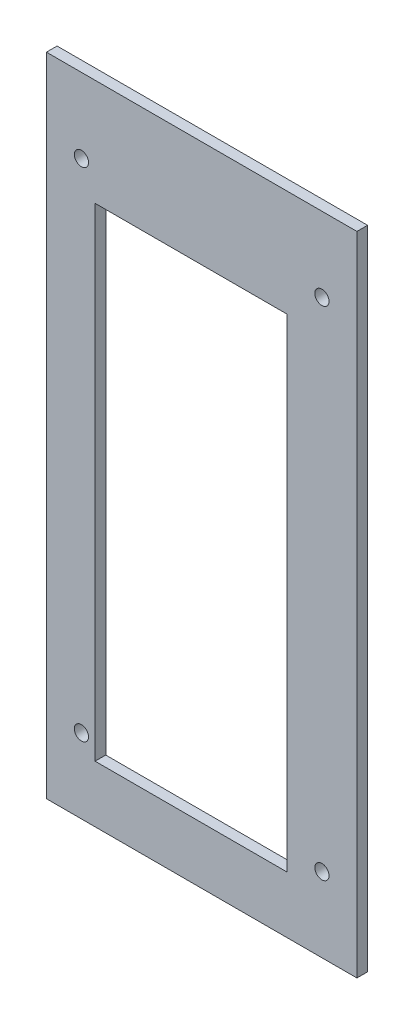
ISO-10303-21;
HEADER;
FILE_DESCRIPTION(('STEP AP214'),'2;1');
FILE_NAME('part.step','',(''),(''),'','','');
FILE_SCHEMA(('AUTOMOTIVE_DESIGN { 1 0 10303 214 1 1 1 1 }'));
ENDSEC;
DATA;
#1=APPLICATION_CONTEXT('core data for automotive mechanical design processes');
#2=APPLICATION_PROTOCOL_DEFINITION('international standard','automotive_design',2000,#1);
#3=PRODUCT_CONTEXT('',#1,'mechanical');
#4=PRODUCT('Part','Part','',(#3));
#5=PRODUCT_RELATED_PRODUCT_CATEGORY('part','',(#4));
#6=PRODUCT_DEFINITION_FORMATION('','',#4);
#7=PRODUCT_DEFINITION_CONTEXT('part definition',#1,'design');
#8=PRODUCT_DEFINITION('design','',#6,#7);
#9=PRODUCT_DEFINITION_SHAPE('','',#8);
#10=(LENGTH_UNIT() NAMED_UNIT(*) SI_UNIT(.MILLI.,.METRE.));
#11=(NAMED_UNIT(*) PLANE_ANGLE_UNIT() SI_UNIT($,.RADIAN.));
#12=(NAMED_UNIT(*) SI_UNIT($,.STERADIAN.) SOLID_ANGLE_UNIT());
#13=UNCERTAINTY_MEASURE_WITH_UNIT(LENGTH_MEASURE(1.E-05),#10,'distance_accuracy_value','');
#14=(GEOMETRIC_REPRESENTATION_CONTEXT(3) GLOBAL_UNCERTAINTY_ASSIGNED_CONTEXT((#13)) GLOBAL_UNIT_ASSIGNED_CONTEXT((#10,
#11,#12)) REPRESENTATION_CONTEXT('',''));
#15=CARTESIAN_POINT('',(0.,0.,0.));
#16=DIRECTION('',(0.,0.,1.));
#17=DIRECTION('',(1.,0.,0.));
#18=AXIS2_PLACEMENT_3D('',#15,#16,#17);
#19=CARTESIAN_POINT('',(0.,0.,1.5));
#20=DIRECTION('',(0.,0.,1.));
#21=DIRECTION('',(1.,0.,0.));
#22=AXIS2_PLACEMENT_3D('',#19,#20,#21);
#23=PLANE('',#22);
#24=CARTESIAN_POINT('',(-16.925,35.,1.5));
#25=DIRECTION('',(0.,0.,1.));
#26=DIRECTION('',(1.,0.,0.));
#27=AXIS2_PLACEMENT_3D('',#24,#25,#26);
#28=CIRCLE('',#27,1.00000000000001);
#29=CARTESIAN_POINT('',(-15.925,35.,1.5));
#30=VERTEX_POINT('',#29);
#31=EDGE_CURVE('E244',#30,#30,#28,.T.);
#32=ORIENTED_EDGE('',*,*,#31,.F.);
#33=EDGE_LOOP('',(#32));
#34=FACE_BOUND('',#33,.T.);
#35=CARTESIAN_POINT('',(16.925,35.,1.5));
#36=DIRECTION('',(0.,0.,1.));
#37=DIRECTION('',(1.,0.,0.));
#38=AXIS2_PLACEMENT_3D('',#35,#36,#37);
#39=CIRCLE('',#38,1.);
#40=CARTESIAN_POINT('',(17.925,35.,1.5));
#41=VERTEX_POINT('',#40);
#42=EDGE_CURVE('E126',#41,#41,#39,.T.);
#43=ORIENTED_EDGE('',*,*,#42,.F.);
#44=EDGE_LOOP('',(#43));
#45=FACE_BOUND('',#44,.T.);
#46=DIRECTION('',(0.,1.,0.));
#47=VECTOR('',#46,1.);
#48=CARTESIAN_POINT('',(21.85,45.5,1.5));
#49=LINE('',#48,#47);
#50=CARTESIAN_POINT('',(21.85,-45.5,1.5));
#51=VERTEX_POINT('',#50);
#52=CARTESIAN_POINT('',(21.85,45.5,1.5));
#53=VERTEX_POINT('',#52);
#54=EDGE_CURVE('E136',#51,#53,#49,.T.);
#55=ORIENTED_EDGE('',*,*,#54,.T.);
#56=DIRECTION('',(-1.,0.,0.));
#57=VECTOR('',#56,1.);
#58=CARTESIAN_POINT('',(-21.85,45.5,1.5));
#59=LINE('',#58,#57);
#60=CARTESIAN_POINT('',(-21.85,45.5,1.5));
#61=VERTEX_POINT('',#60);
#62=EDGE_CURVE('E139',#53,#61,#59,.T.);
#63=ORIENTED_EDGE('',*,*,#62,.T.);
#64=DIRECTION('',(0.,-1.,0.));
#65=VECTOR('',#64,1.);
#66=CARTESIAN_POINT('',(-21.85,45.5,1.5));
#67=LINE('',#66,#65);
#68=CARTESIAN_POINT('',(-21.85,-45.5,1.5));
#69=VERTEX_POINT('',#68);
#70=EDGE_CURVE('E142',#61,#69,#67,.T.);
#71=ORIENTED_EDGE('',*,*,#70,.T.);
#72=DIRECTION('',(1.,0.,0.));
#73=VECTOR('',#72,1.);
#74=CARTESIAN_POINT('',(-21.85,-45.5,1.5));
#75=LINE('',#74,#73);
#76=EDGE_CURVE('E144',#69,#51,#75,.T.);
#77=ORIENTED_EDGE('',*,*,#76,.T.);
#78=EDGE_LOOP('',(#55,#63,#71,#77));
#79=FACE_BOUND('',#78,.T.);
#80=DIRECTION('',(1.,0.,0.));
#81=VECTOR('',#80,1.);
#82=CARTESIAN_POINT('',(-15.,-37.5,1.5));
#83=LINE('',#82,#81);
#84=CARTESIAN_POINT('',(-15.,-37.5,1.5));
#85=VERTEX_POINT('',#84);
#86=CARTESIAN_POINT('',(12.,-37.5,1.5));
#87=VERTEX_POINT('',#86);
#88=EDGE_CURVE('E105',#85,#87,#83,.T.);
#89=ORIENTED_EDGE('',*,*,#88,.F.);
#90=DIRECTION('',(0.,-1.,0.));
#91=VECTOR('',#90,1.);
#92=CARTESIAN_POINT('',(-15.,30.5,1.5));
#93=LINE('',#92,#91);
#94=CARTESIAN_POINT('',(-15.,30.5,1.5));
#95=VERTEX_POINT('',#94);
#96=EDGE_CURVE('E97',#95,#85,#93,.T.);
#97=ORIENTED_EDGE('',*,*,#96,.F.);
#98=DIRECTION('',(-1.,0.,0.));
#99=VECTOR('',#98,1.);
#100=CARTESIAN_POINT('',(-15.,30.5,1.5));
#101=LINE('',#100,#99);
#102=CARTESIAN_POINT('',(12.,30.5,1.5));
#103=VERTEX_POINT('',#102);
#104=EDGE_CURVE('E120',#103,#95,#101,.T.);
#105=ORIENTED_EDGE('',*,*,#104,.F.);
#106=DIRECTION('',(0.,1.,0.));
#107=VECTOR('',#106,1.);
#108=CARTESIAN_POINT('',(12.,30.5,1.5));
#109=LINE('',#108,#107);
#110=EDGE_CURVE('E118',#87,#103,#109,.T.);
#111=ORIENTED_EDGE('',*,*,#110,.F.);
#112=EDGE_LOOP('',(#89,#97,#105,#111));
#113=FACE_BOUND('',#112,.T.);
#114=CARTESIAN_POINT('',(16.925,-35.,1.5));
#115=DIRECTION('',(0.,0.,1.));
#116=DIRECTION('',(1.,0.,0.));
#117=AXIS2_PLACEMENT_3D('',#114,#115,#116);
#118=CIRCLE('',#117,1.);
#119=CARTESIAN_POINT('',(17.925,-35.,1.5));
#120=VERTEX_POINT('',#119);
#121=EDGE_CURVE('E250',#120,#120,#118,.T.);
#122=ORIENTED_EDGE('',*,*,#121,.F.);
#123=EDGE_LOOP('',(#122));
#124=FACE_BOUND('',#123,.T.);
#125=CARTESIAN_POINT('',(-16.925,-35.,1.5));
#126=DIRECTION('',(0.,0.,1.));
#127=DIRECTION('',(1.,0.,0.));
#128=AXIS2_PLACEMENT_3D('',#125,#126,#127);
#129=CIRCLE('',#128,1.00000000000001);
#130=CARTESIAN_POINT('',(-15.925,-35.,1.5));
#131=VERTEX_POINT('',#130);
#132=EDGE_CURVE('E235',#131,#131,#129,.T.);
#133=ORIENTED_EDGE('',*,*,#132,.F.);
#134=EDGE_LOOP('',(#133));
#135=FACE_BOUND('',#134,.T.);
#136=ADVANCED_FACE('F32',(#34,#45,#79,#113,#124,#135),#23,.T.);
#137=CARTESIAN_POINT('',(0.,0.,0.));
#138=DIRECTION('',(0.,0.,1.));
#139=DIRECTION('',(1.,0.,0.));
#140=AXIS2_PLACEMENT_3D('',#137,#138,#139);
#141=PLANE('',#140);
#142=DIRECTION('',(0.,1.,0.));
#143=VECTOR('',#142,1.);
#144=CARTESIAN_POINT('',(21.85,45.5,0.));
#145=LINE('',#144,#143);
#146=CARTESIAN_POINT('',(21.85,-45.5,0.));
#147=VERTEX_POINT('',#146);
#148=CARTESIAN_POINT('',(21.85,45.5,0.));
#149=VERTEX_POINT('',#148);
#150=EDGE_CURVE('E113',#147,#149,#145,.T.);
#151=ORIENTED_EDGE('',*,*,#150,.F.);
#152=DIRECTION('',(1.,0.,0.));
#153=VECTOR('',#152,1.);
#154=CARTESIAN_POINT('',(-21.85,-45.5,0.));
#155=LINE('',#154,#153);
#156=CARTESIAN_POINT('',(-21.85,-45.5,0.));
#157=VERTEX_POINT('',#156);
#158=EDGE_CURVE('E140',#157,#147,#155,.T.);
#159=ORIENTED_EDGE('',*,*,#158,.F.);
#160=DIRECTION('',(0.,-1.,0.));
#161=VECTOR('',#160,1.);
#162=CARTESIAN_POINT('',(-21.85,45.5,0.));
#163=LINE('',#162,#161);
#164=CARTESIAN_POINT('',(-21.85,45.5,0.));
#165=VERTEX_POINT('',#164);
#166=EDGE_CURVE('E151',#165,#157,#163,.T.);
#167=ORIENTED_EDGE('',*,*,#166,.F.);
#168=DIRECTION('',(-1.,0.,0.));
#169=VECTOR('',#168,1.);
#170=CARTESIAN_POINT('',(-21.85,45.5,0.));
#171=LINE('',#170,#169);
#172=EDGE_CURVE('E149',#149,#165,#171,.T.);
#173=ORIENTED_EDGE('',*,*,#172,.F.);
#174=EDGE_LOOP('',(#151,#159,#167,#173));
#175=FACE_BOUND('',#174,.T.);
#176=DIRECTION('',(0.,-1.,0.));
#177=VECTOR('',#176,1.);
#178=CARTESIAN_POINT('',(-15.,30.5,0.));
#179=LINE('',#178,#177);
#180=CARTESIAN_POINT('',(-15.,30.5,0.));
#181=VERTEX_POINT('',#180);
#182=CARTESIAN_POINT('',(-15.,-37.5,0.));
#183=VERTEX_POINT('',#182);
#184=EDGE_CURVE('E55',#181,#183,#179,.T.);
#185=ORIENTED_EDGE('',*,*,#184,.T.);
#186=DIRECTION('',(1.,0.,0.));
#187=VECTOR('',#186,1.);
#188=CARTESIAN_POINT('',(-15.,-37.5,0.));
#189=LINE('',#188,#187);
#190=CARTESIAN_POINT('',(12.,-37.5,0.));
#191=VERTEX_POINT('',#190);
#192=EDGE_CURVE('E112',#183,#191,#189,.T.);
#193=ORIENTED_EDGE('',*,*,#192,.T.);
#194=DIRECTION('',(0.,1.,0.));
#195=VECTOR('',#194,1.);
#196=CARTESIAN_POINT('',(12.,30.5,0.));
#197=LINE('',#196,#195);
#198=CARTESIAN_POINT('',(12.,30.5,0.));
#199=VERTEX_POINT('',#198);
#200=EDGE_CURVE('E128',#191,#199,#197,.T.);
#201=ORIENTED_EDGE('',*,*,#200,.T.);
#202=DIRECTION('',(-1.,0.,0.));
#203=VECTOR('',#202,1.);
#204=CARTESIAN_POINT('',(-15.,30.5,0.));
#205=LINE('',#204,#203);
#206=EDGE_CURVE('E106',#199,#181,#205,.T.);
#207=ORIENTED_EDGE('',*,*,#206,.T.);
#208=EDGE_LOOP('',(#185,#193,#201,#207));
#209=FACE_BOUND('',#208,.T.);
#210=CARTESIAN_POINT('',(16.925,35.,0.));
#211=DIRECTION('',(0.,0.,1.));
#212=DIRECTION('',(1.,0.,0.));
#213=AXIS2_PLACEMENT_3D('',#210,#211,#212);
#214=CIRCLE('',#213,1.);
#215=CARTESIAN_POINT('',(17.925,35.,0.));
#216=VERTEX_POINT('',#215);
#217=EDGE_CURVE('E253',#216,#216,#214,.T.);
#218=ORIENTED_EDGE('',*,*,#217,.T.);
#219=EDGE_LOOP('',(#218));
#220=FACE_BOUND('',#219,.T.);
#221=CARTESIAN_POINT('',(16.925,-35.,0.));
#222=DIRECTION('',(0.,0.,1.));
#223=DIRECTION('',(1.,0.,0.));
#224=AXIS2_PLACEMENT_3D('',#221,#222,#223);
#225=CIRCLE('',#224,1.);
#226=CARTESIAN_POINT('',(17.925,-35.,0.));
#227=VERTEX_POINT('',#226);
#228=EDGE_CURVE('E247',#227,#227,#225,.T.);
#229=ORIENTED_EDGE('',*,*,#228,.T.);
#230=EDGE_LOOP('',(#229));
#231=FACE_BOUND('',#230,.T.);
#232=CARTESIAN_POINT('',(-16.925,35.,0.));
#233=DIRECTION('',(0.,0.,1.));
#234=DIRECTION('',(1.,0.,0.));
#235=AXIS2_PLACEMENT_3D('',#232,#233,#234);
#236=CIRCLE('',#235,1.00000000000001);
#237=CARTESIAN_POINT('',(-15.925,35.,0.));
#238=VERTEX_POINT('',#237);
#239=EDGE_CURVE('E241',#238,#238,#236,.T.);
#240=ORIENTED_EDGE('',*,*,#239,.T.);
#241=EDGE_LOOP('',(#240));
#242=FACE_BOUND('',#241,.T.);
#243=CARTESIAN_POINT('',(-16.925,-35.,0.));
#244=DIRECTION('',(0.,0.,1.));
#245=DIRECTION('',(1.,0.,0.));
#246=AXIS2_PLACEMENT_3D('',#243,#244,#245);
#247=CIRCLE('',#246,1.00000000000001);
#248=CARTESIAN_POINT('',(-15.925,-35.,0.));
#249=VERTEX_POINT('',#248);
#250=EDGE_CURVE('E238',#249,#249,#247,.T.);
#251=ORIENTED_EDGE('',*,*,#250,.T.);
#252=EDGE_LOOP('',(#251));
#253=FACE_BOUND('',#252,.T.);
#254=ADVANCED_FACE('F169',(#175,#209,#220,#231,#242,#253),#141,.F.);
#255=CARTESIAN_POINT('',(21.85,45.5,1.5));
#256=DIRECTION('',(-1.,0.,0.));
#257=DIRECTION('',(0.,0.,1.));
#258=AXIS2_PLACEMENT_3D('',#255,#256,#257);
#259=PLANE('',#258);
#260=ORIENTED_EDGE('',*,*,#150,.T.);
#261=DIRECTION('',(0.,0.,-1.));
#262=VECTOR('',#261,1.);
#263=CARTESIAN_POINT('',(21.85,45.5,1.5));
#264=LINE('',#263,#262);
#265=EDGE_CURVE('E11',#53,#149,#264,.T.);
#266=ORIENTED_EDGE('',*,*,#265,.F.);
#267=ORIENTED_EDGE('',*,*,#54,.F.);
#268=DIRECTION('',(0.,0.,-1.));
#269=VECTOR('',#268,1.);
#270=CARTESIAN_POINT('',(21.85,-45.5,1.5));
#271=LINE('',#270,#269);
#272=EDGE_CURVE('E146',#51,#147,#271,.T.);
#273=ORIENTED_EDGE('',*,*,#272,.T.);
#274=EDGE_LOOP('',(#260,#266,#267,#273));
#275=FACE_BOUND('',#274,.T.);
#276=ADVANCED_FACE('F34',(#275),#259,.F.);
#277=CARTESIAN_POINT('',(-21.85,45.5,1.5));
#278=DIRECTION('',(0.,-1.,0.));
#279=DIRECTION('',(1.,0.,0.));
#280=AXIS2_PLACEMENT_3D('',#277,#278,#279);
#281=PLANE('',#280);
#282=ORIENTED_EDGE('',*,*,#172,.T.);
#283=DIRECTION('',(0.,0.,-1.));
#284=VECTOR('',#283,1.);
#285=CARTESIAN_POINT('',(-21.85,45.5,1.5));
#286=LINE('',#285,#284);
#287=EDGE_CURVE('E40',#61,#165,#286,.T.);
#288=ORIENTED_EDGE('',*,*,#287,.F.);
#289=ORIENTED_EDGE('',*,*,#62,.F.);
#290=ORIENTED_EDGE('',*,*,#265,.T.);
#291=EDGE_LOOP('',(#282,#288,#289,#290));
#292=FACE_BOUND('',#291,.T.);
#293=ADVANCED_FACE('F179',(#292),#281,.F.);
#294=CARTESIAN_POINT('',(-21.85,45.5,1.5));
#295=DIRECTION('',(1.,0.,0.));
#296=DIRECTION('',(0.,1.,0.));
#297=AXIS2_PLACEMENT_3D('',#294,#295,#296);
#298=PLANE('',#297);
#299=ORIENTED_EDGE('',*,*,#166,.T.);
#300=DIRECTION('',(0.,0.,-1.));
#301=VECTOR('',#300,1.);
#302=CARTESIAN_POINT('',(-21.85,-45.5,1.5));
#303=LINE('',#302,#301);
#304=EDGE_CURVE('E156',#69,#157,#303,.T.);
#305=ORIENTED_EDGE('',*,*,#304,.F.);
#306=ORIENTED_EDGE('',*,*,#70,.F.);
#307=ORIENTED_EDGE('',*,*,#287,.T.);
#308=EDGE_LOOP('',(#299,#305,#306,#307));
#309=FACE_BOUND('',#308,.T.);
#310=ADVANCED_FACE('F163',(#309),#298,.F.);
#311=CARTESIAN_POINT('',(-21.85,-45.5,1.5));
#312=DIRECTION('',(0.,1.,0.));
#313=DIRECTION('',(-1.,0.,0.));
#314=AXIS2_PLACEMENT_3D('',#311,#312,#313);
#315=PLANE('',#314);
#316=ORIENTED_EDGE('',*,*,#158,.T.);
#317=ORIENTED_EDGE('',*,*,#272,.F.);
#318=ORIENTED_EDGE('',*,*,#76,.F.);
#319=ORIENTED_EDGE('',*,*,#304,.T.);
#320=EDGE_LOOP('',(#316,#317,#318,#319));
#321=FACE_BOUND('',#320,.T.);
#322=ADVANCED_FACE('F173',(#321),#315,.F.);
#323=CARTESIAN_POINT('',(-15.,30.5,1.5));
#324=DIRECTION('',(1.,0.,0.));
#325=DIRECTION('',(0.,1.,0.));
#326=AXIS2_PLACEMENT_3D('',#323,#324,#325);
#327=PLANE('',#326);
#328=ORIENTED_EDGE('',*,*,#184,.F.);
#329=DIRECTION('',(0.,0.,-1.));
#330=VECTOR('',#329,1.);
#331=CARTESIAN_POINT('',(-15.,30.5,1.5));
#332=LINE('',#331,#330);
#333=EDGE_CURVE('E101',#95,#181,#332,.T.);
#334=ORIENTED_EDGE('',*,*,#333,.F.);
#335=ORIENTED_EDGE('',*,*,#96,.T.);
#336=DIRECTION('',(0.,0.,-1.));
#337=VECTOR('',#336,1.);
#338=CARTESIAN_POINT('',(-15.,-37.5,1.5));
#339=LINE('',#338,#337);
#340=EDGE_CURVE('E100',#85,#183,#339,.T.);
#341=ORIENTED_EDGE('',*,*,#340,.T.);
#342=EDGE_LOOP('',(#328,#334,#335,#341));
#343=FACE_BOUND('',#342,.T.);
#344=ADVANCED_FACE('F99',(#343),#327,.T.);
#345=CARTESIAN_POINT('',(-15.,-37.5,1.5));
#346=DIRECTION('',(0.,1.,0.));
#347=DIRECTION('',(0.,0.,1.));
#348=AXIS2_PLACEMENT_3D('',#345,#346,#347);
#349=PLANE('',#348);
#350=ORIENTED_EDGE('',*,*,#192,.F.);
#351=ORIENTED_EDGE('',*,*,#340,.F.);
#352=ORIENTED_EDGE('',*,*,#88,.T.);
#353=DIRECTION('',(0.,0.,-1.));
#354=VECTOR('',#353,1.);
#355=CARTESIAN_POINT('',(12.,-37.5,1.5));
#356=LINE('',#355,#354);
#357=EDGE_CURVE('E114',#87,#191,#356,.T.);
#358=ORIENTED_EDGE('',*,*,#357,.T.);
#359=EDGE_LOOP('',(#350,#351,#352,#358));
#360=FACE_BOUND('',#359,.T.);
#361=ADVANCED_FACE('F109',(#360),#349,.T.);
#362=CARTESIAN_POINT('',(12.,30.5,1.5));
#363=DIRECTION('',(-1.,0.,0.));
#364=DIRECTION('',(0.,-1.,0.));
#365=AXIS2_PLACEMENT_3D('',#362,#363,#364);
#366=PLANE('',#365);
#367=ORIENTED_EDGE('',*,*,#200,.F.);
#368=ORIENTED_EDGE('',*,*,#357,.F.);
#369=ORIENTED_EDGE('',*,*,#110,.T.);
#370=DIRECTION('',(0.,0.,-1.));
#371=VECTOR('',#370,1.);
#372=CARTESIAN_POINT('',(12.,30.5,1.5));
#373=LINE('',#372,#371);
#374=EDGE_CURVE('E47',#103,#199,#373,.T.);
#375=ORIENTED_EDGE('',*,*,#374,.T.);
#376=EDGE_LOOP('',(#367,#368,#369,#375));
#377=FACE_BOUND('',#376,.T.);
#378=ADVANCED_FACE('F205',(#377),#366,.T.);
#379=CARTESIAN_POINT('',(-15.,30.5,1.5));
#380=DIRECTION('',(0.,-1.,0.));
#381=DIRECTION('',(0.,0.,-1.));
#382=AXIS2_PLACEMENT_3D('',#379,#380,#381);
#383=PLANE('',#382);
#384=ORIENTED_EDGE('',*,*,#206,.F.);
#385=ORIENTED_EDGE('',*,*,#374,.F.);
#386=ORIENTED_EDGE('',*,*,#104,.T.);
#387=ORIENTED_EDGE('',*,*,#333,.T.);
#388=EDGE_LOOP('',(#384,#385,#386,#387));
#389=FACE_BOUND('',#388,.T.);
#390=ADVANCED_FACE('F209',(#389),#383,.T.);
#391=CARTESIAN_POINT('',(16.925,35.,1.5));
#392=DIRECTION('',(0.,0.,-1.));
#393=DIRECTION('',(-1.,0.,0.));
#394=AXIS2_PLACEMENT_3D('',#391,#392,#393);
#395=CYLINDRICAL_SURFACE('',#394,1.);
#396=ORIENTED_EDGE('',*,*,#42,.T.);
#397=EDGE_LOOP('',(#396));
#398=FACE_BOUND('',#397,.T.);
#399=ORIENTED_EDGE('',*,*,#217,.F.);
#400=EDGE_LOOP('',(#399));
#401=FACE_BOUND('',#400,.T.);
#402=ADVANCED_FACE('F215',(#398,#401),#395,.F.);
#403=CARTESIAN_POINT('',(16.925,-35.,1.5));
#404=DIRECTION('',(0.,0.,-1.));
#405=DIRECTION('',(-1.,0.,0.));
#406=AXIS2_PLACEMENT_3D('',#403,#404,#405);
#407=CYLINDRICAL_SURFACE('',#406,1.);
#408=ORIENTED_EDGE('',*,*,#121,.T.);
#409=EDGE_LOOP('',(#408));
#410=FACE_BOUND('',#409,.T.);
#411=ORIENTED_EDGE('',*,*,#228,.F.);
#412=EDGE_LOOP('',(#411));
#413=FACE_BOUND('',#412,.T.);
#414=ADVANCED_FACE('F218',(#410,#413),#407,.F.);
#415=CARTESIAN_POINT('',(-16.925,35.,1.5));
#416=DIRECTION('',(0.,0.,-1.));
#417=DIRECTION('',(-1.,0.,0.));
#418=AXIS2_PLACEMENT_3D('',#415,#416,#417);
#419=CYLINDRICAL_SURFACE('',#418,1.00000000000001);
#420=ORIENTED_EDGE('',*,*,#31,.T.);
#421=EDGE_LOOP('',(#420));
#422=FACE_BOUND('',#421,.T.);
#423=ORIENTED_EDGE('',*,*,#239,.F.);
#424=EDGE_LOOP('',(#423));
#425=FACE_BOUND('',#424,.T.);
#426=ADVANCED_FACE('F222',(#422,#425),#419,.F.);
#427=CARTESIAN_POINT('',(-16.925,-35.,1.5));
#428=DIRECTION('',(0.,0.,-1.));
#429=DIRECTION('',(-1.,0.,0.));
#430=AXIS2_PLACEMENT_3D('',#427,#428,#429);
#431=CYLINDRICAL_SURFACE('',#430,1.00000000000001);
#432=ORIENTED_EDGE('',*,*,#132,.T.);
#433=EDGE_LOOP('',(#432));
#434=FACE_BOUND('',#433,.T.);
#435=ORIENTED_EDGE('',*,*,#250,.F.);
#436=EDGE_LOOP('',(#435));
#437=FACE_BOUND('',#436,.T.);
#438=ADVANCED_FACE('F226',(#434,#437),#431,.F.);
#439=CLOSED_SHELL('',(#136,#254,#276,#293,#310,#322,#344,#361,#378,#390,#402,#414,#426,#438));
#440=MANIFOLD_SOLID_BREP('B2',#439);
#441=ADVANCED_BREP_SHAPE_REPRESENTATION('',(#18,#440),#14);
#442=SHAPE_DEFINITION_REPRESENTATION(#9,#441);
ENDSEC;
END-ISO-10303-21;
